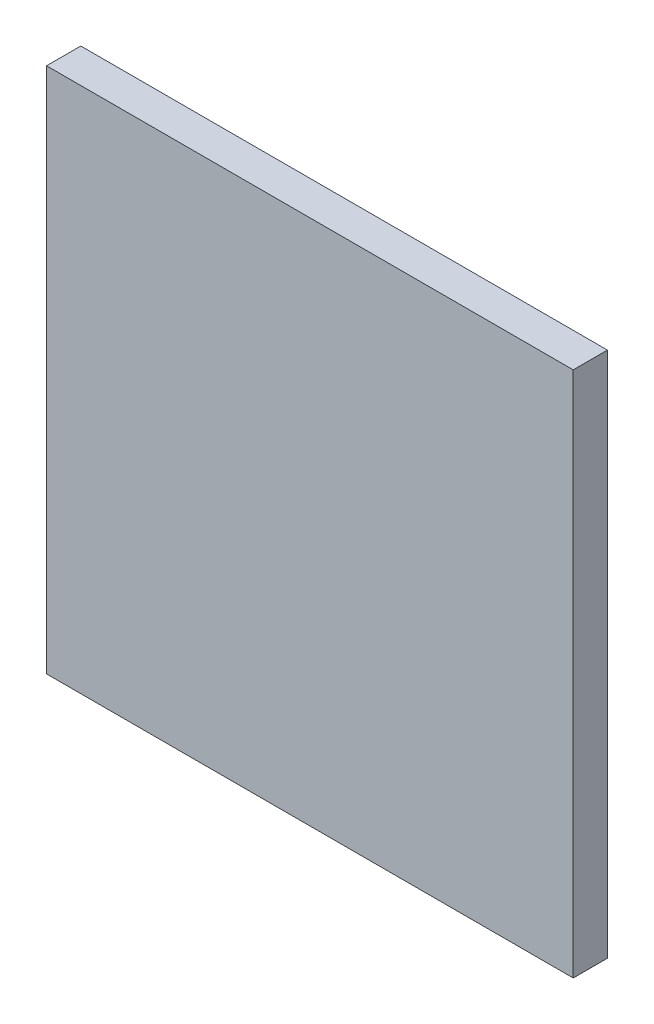
ISO-10303-21;
HEADER;
FILE_DESCRIPTION(('STEP AP214'),'2;1');
FILE_NAME('part.step','',(''),(''),'','','');
FILE_SCHEMA(('AUTOMOTIVE_DESIGN { 1 0 10303 214 1 1 1 1 }'));
ENDSEC;
DATA;
#1=APPLICATION_CONTEXT('core data for automotive mechanical design processes');
#2=APPLICATION_PROTOCOL_DEFINITION('international standard','automotive_design',2000,#1);
#3=PRODUCT_CONTEXT('',#1,'mechanical');
#4=PRODUCT('Part','Part','',(#3));
#5=PRODUCT_RELATED_PRODUCT_CATEGORY('part','',(#4));
#6=PRODUCT_DEFINITION_FORMATION('','',#4);
#7=PRODUCT_DEFINITION_CONTEXT('part definition',#1,'design');
#8=PRODUCT_DEFINITION('design','',#6,#7);
#9=PRODUCT_DEFINITION_SHAPE('','',#8);
#10=(LENGTH_UNIT() NAMED_UNIT(*) SI_UNIT(.MILLI.,.METRE.));
#11=(NAMED_UNIT(*) PLANE_ANGLE_UNIT() SI_UNIT($,.RADIAN.));
#12=(NAMED_UNIT(*) SI_UNIT($,.STERADIAN.) SOLID_ANGLE_UNIT());
#13=UNCERTAINTY_MEASURE_WITH_UNIT(LENGTH_MEASURE(1.E-05),#10,'distance_accuracy_value','');
#14=(GEOMETRIC_REPRESENTATION_CONTEXT(3) GLOBAL_UNCERTAINTY_ASSIGNED_CONTEXT((#13)) GLOBAL_UNIT_ASSIGNED_CONTEXT((#10,
#11,#12)) REPRESENTATION_CONTEXT('',''));
#15=CARTESIAN_POINT('',(0.,0.,0.));
#16=DIRECTION('',(0.,0.,1.));
#17=DIRECTION('',(1.,0.,0.));
#18=AXIS2_PLACEMENT_3D('',#15,#16,#17);
#19=CARTESIAN_POINT('',(0.,0.,0.65));
#20=DIRECTION('',(-1.,0.,0.));
#21=DIRECTION('',(0.,0.,1.));
#22=AXIS2_PLACEMENT_3D('',#19,#20,#21);
#23=PLANE('',#22);
#24=DIRECTION('',(0.,1.,0.));
#25=VECTOR('',#24,1.);
#26=CARTESIAN_POINT('',(0.,0.,0.));
#27=LINE('',#26,#25);
#28=CARTESIAN_POINT('',(0.,-10.,0.));
#29=VERTEX_POINT('',#28);
#30=CARTESIAN_POINT('',(0.,0.,0.));
#31=VERTEX_POINT('',#30);
#32=EDGE_CURVE('E111',#29,#31,#27,.T.);
#33=ORIENTED_EDGE('',*,*,#32,.T.);
#34=DIRECTION('',(0.,0.,-1.));
#35=VECTOR('',#34,1.);
#36=CARTESIAN_POINT('',(0.,0.,0.65));
#37=LINE('',#36,#35);
#38=CARTESIAN_POINT('',(0.,0.,0.65));
#39=VERTEX_POINT('',#38);
#40=EDGE_CURVE('E11',#39,#31,#37,.T.);
#41=ORIENTED_EDGE('',*,*,#40,.F.);
#42=DIRECTION('',(0.,1.,0.));
#43=VECTOR('',#42,1.);
#44=CARTESIAN_POINT('',(0.,0.,0.65));
#45=LINE('',#44,#43);
#46=CARTESIAN_POINT('',(0.,-10.,0.65));
#47=VERTEX_POINT('',#46);
#48=EDGE_CURVE('E95',#47,#39,#45,.T.);
#49=ORIENTED_EDGE('',*,*,#48,.F.);
#50=DIRECTION('',(0.,0.,-1.));
#51=VECTOR('',#50,1.);
#52=CARTESIAN_POINT('',(0.,-10.,0.65));
#53=LINE('',#52,#51);
#54=EDGE_CURVE('E107',#47,#29,#53,.T.);
#55=ORIENTED_EDGE('',*,*,#54,.T.);
#56=EDGE_LOOP('',(#33,#41,#49,#55));
#57=FACE_BOUND('',#56,.T.);
#58=ADVANCED_FACE('F43',(#57),#23,.F.);
#59=CARTESIAN_POINT('',(0.,0.,0.65));
#60=DIRECTION('',(0.,-1.,0.));
#61=DIRECTION('',(1.,0.,0.));
#62=AXIS2_PLACEMENT_3D('',#59,#60,#61);
#63=PLANE('',#62);
#64=DIRECTION('',(-1.,0.,0.));
#65=VECTOR('',#64,1.);
#66=CARTESIAN_POINT('',(0.,0.,0.));
#67=LINE('',#66,#65);
#68=CARTESIAN_POINT('',(-10.,0.,0.));
#69=VERTEX_POINT('',#68);
#70=EDGE_CURVE('E100',#31,#69,#67,.T.);
#71=ORIENTED_EDGE('',*,*,#70,.T.);
#72=DIRECTION('',(0.,0.,-1.));
#73=VECTOR('',#72,1.);
#74=CARTESIAN_POINT('',(-10.,0.,0.65));
#75=LINE('',#74,#73);
#76=CARTESIAN_POINT('',(-10.,0.,0.65));
#77=VERTEX_POINT('',#76);
#78=EDGE_CURVE('E52',#77,#69,#75,.T.);
#79=ORIENTED_EDGE('',*,*,#78,.F.);
#80=DIRECTION('',(-1.,0.,0.));
#81=VECTOR('',#80,1.);
#82=CARTESIAN_POINT('',(0.,0.,0.65));
#83=LINE('',#82,#81);
#84=EDGE_CURVE('E90',#39,#77,#83,.T.);
#85=ORIENTED_EDGE('',*,*,#84,.F.);
#86=ORIENTED_EDGE('',*,*,#40,.T.);
#87=EDGE_LOOP('',(#71,#79,#85,#86));
#88=FACE_BOUND('',#87,.T.);
#89=ADVANCED_FACE('F99',(#88),#63,.F.);
#90=CARTESIAN_POINT('',(-10.,0.,0.65));
#91=DIRECTION('',(1.,0.,0.));
#92=DIRECTION('',(0.,1.,0.));
#93=AXIS2_PLACEMENT_3D('',#90,#91,#92);
#94=PLANE('',#93);
#95=DIRECTION('',(0.,-1.,0.));
#96=VECTOR('',#95,1.);
#97=CARTESIAN_POINT('',(-10.,0.,0.));
#98=LINE('',#97,#96);
#99=CARTESIAN_POINT('',(-10.,-10.,0.));
#100=VERTEX_POINT('',#99);
#101=EDGE_CURVE('E77',#69,#100,#98,.T.);
#102=ORIENTED_EDGE('',*,*,#101,.T.);
#103=DIRECTION('',(0.,0.,-1.));
#104=VECTOR('',#103,1.);
#105=CARTESIAN_POINT('',(-10.,-10.,0.65));
#106=LINE('',#105,#104);
#107=CARTESIAN_POINT('',(-10.,-10.,0.65));
#108=VERTEX_POINT('',#107);
#109=EDGE_CURVE('E102',#108,#100,#106,.T.);
#110=ORIENTED_EDGE('',*,*,#109,.F.);
#111=DIRECTION('',(0.,-1.,0.));
#112=VECTOR('',#111,1.);
#113=CARTESIAN_POINT('',(-10.,0.,0.65));
#114=LINE('',#113,#112);
#115=EDGE_CURVE('E93',#77,#108,#114,.T.);
#116=ORIENTED_EDGE('',*,*,#115,.F.);
#117=ORIENTED_EDGE('',*,*,#78,.T.);
#118=EDGE_LOOP('',(#102,#110,#116,#117));
#119=FACE_BOUND('',#118,.T.);
#120=ADVANCED_FACE('F103',(#119),#94,.F.);
#121=CARTESIAN_POINT('',(0.,-10.,0.65));
#122=DIRECTION('',(0.,1.,0.));
#123=DIRECTION('',(-1.,0.,0.));
#124=AXIS2_PLACEMENT_3D('',#121,#122,#123);
#125=PLANE('',#124);
#126=DIRECTION('',(1.,0.,0.));
#127=VECTOR('',#126,1.);
#128=CARTESIAN_POINT('',(0.,-10.,0.));
#129=LINE('',#128,#127);
#130=EDGE_CURVE('E83',#100,#29,#129,.T.);
#131=ORIENTED_EDGE('',*,*,#130,.T.);
#132=ORIENTED_EDGE('',*,*,#54,.F.);
#133=DIRECTION('',(1.,0.,0.));
#134=VECTOR('',#133,1.);
#135=CARTESIAN_POINT('',(0.,-10.,0.65));
#136=LINE('',#135,#134);
#137=EDGE_CURVE('E60',#108,#47,#136,.T.);
#138=ORIENTED_EDGE('',*,*,#137,.F.);
#139=ORIENTED_EDGE('',*,*,#109,.T.);
#140=EDGE_LOOP('',(#131,#132,#138,#139));
#141=FACE_BOUND('',#140,.T.);
#142=ADVANCED_FACE('F124',(#141),#125,.F.);
#143=CARTESIAN_POINT('',(0.,0.,0.65));
#144=DIRECTION('',(0.,0.,-1.));
#145=DIRECTION('',(-1.,0.,0.));
#146=AXIS2_PLACEMENT_3D('',#143,#144,#145);
#147=PLANE('',#146);
#148=ORIENTED_EDGE('',*,*,#48,.T.);
#149=ORIENTED_EDGE('',*,*,#84,.T.);
#150=ORIENTED_EDGE('',*,*,#115,.T.);
#151=ORIENTED_EDGE('',*,*,#137,.T.);
#152=EDGE_LOOP('',(#148,#149,#150,#151));
#153=FACE_BOUND('',#152,.T.);
#154=ADVANCED_FACE('F91',(#153),#147,.F.);
#155=CARTESIAN_POINT('',(0.,0.,0.));
#156=DIRECTION('',(0.,0.,-1.));
#157=DIRECTION('',(-1.,0.,0.));
#158=AXIS2_PLACEMENT_3D('',#155,#156,#157);
#159=PLANE('',#158);
#160=ORIENTED_EDGE('',*,*,#32,.F.);
#161=ORIENTED_EDGE('',*,*,#130,.F.);
#162=ORIENTED_EDGE('',*,*,#101,.F.);
#163=ORIENTED_EDGE('',*,*,#70,.F.);
#164=EDGE_LOOP('',(#160,#161,#162,#163));
#165=FACE_BOUND('',#164,.T.);
#166=ADVANCED_FACE('F127',(#165),#159,.T.);
#167=CLOSED_SHELL('',(#58,#89,#120,#142,#154,#166));
#168=MANIFOLD_SOLID_BREP('B2',#167);
#169=ADVANCED_BREP_SHAPE_REPRESENTATION('',(#18,#168),#14);
#170=SHAPE_DEFINITION_REPRESENTATION(#9,#169);
ENDSEC;
END-ISO-10303-21;
